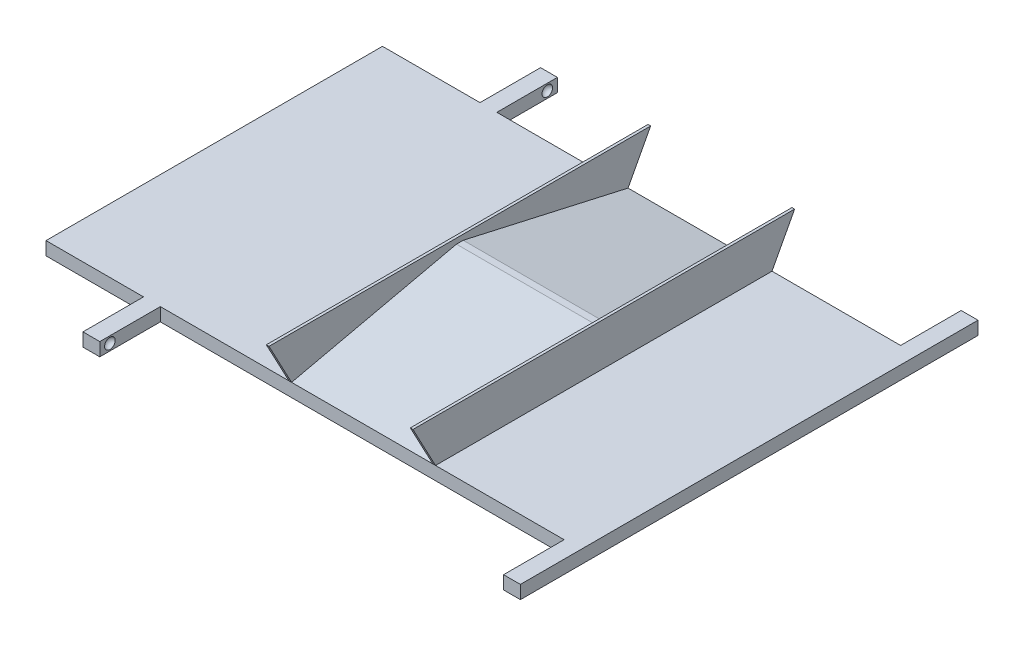
ISO-10303-21;
HEADER;
FILE_DESCRIPTION(('STEP AP214'),'2;1');
FILE_NAME('part.step','',(''),(''),'','','');
FILE_SCHEMA(('AUTOMOTIVE_DESIGN { 1 0 10303 214 1 1 1 1 }'));
ENDSEC;
DATA;
#1=APPLICATION_CONTEXT('core data for automotive mechanical design processes');
#2=APPLICATION_PROTOCOL_DEFINITION('international standard','automotive_design',2000,#1);
#3=PRODUCT_CONTEXT('',#1,'mechanical');
#4=PRODUCT('Part','Part','',(#3));
#5=PRODUCT_RELATED_PRODUCT_CATEGORY('part','',(#4));
#6=PRODUCT_DEFINITION_FORMATION('','',#4);
#7=PRODUCT_DEFINITION_CONTEXT('part definition',#1,'design');
#8=PRODUCT_DEFINITION('design','',#6,#7);
#9=PRODUCT_DEFINITION_SHAPE('','',#8);
#10=(LENGTH_UNIT() NAMED_UNIT(*) SI_UNIT(.MILLI.,.METRE.));
#11=(NAMED_UNIT(*) PLANE_ANGLE_UNIT() SI_UNIT($,.RADIAN.));
#12=(NAMED_UNIT(*) SI_UNIT($,.STERADIAN.) SOLID_ANGLE_UNIT());
#13=UNCERTAINTY_MEASURE_WITH_UNIT(LENGTH_MEASURE(1.E-05),#10,'distance_accuracy_value','');
#14=(GEOMETRIC_REPRESENTATION_CONTEXT(3) GLOBAL_UNCERTAINTY_ASSIGNED_CONTEXT((#13)) GLOBAL_UNIT_ASSIGNED_CONTEXT((#10,
#11,#12)) REPRESENTATION_CONTEXT('',''));
#15=CARTESIAN_POINT('',(0.,0.,0.));
#16=DIRECTION('',(0.,0.,1.));
#17=DIRECTION('',(1.,0.,0.));
#18=AXIS2_PLACEMENT_3D('',#15,#16,#17);
#19=CARTESIAN_POINT('',(0.,5.,0.));
#20=DIRECTION('',(0.,1.,0.));
#21=DIRECTION('',(0.,0.,1.));
#22=AXIS2_PLACEMENT_3D('',#19,#20,#21);
#23=PLANE('',#22);
#24=DIRECTION('',(1.,0.,0.));
#25=VECTOR('',#24,1.);
#26=CARTESIAN_POINT('',(-76.2,5.,63.5000000000001));
#27=LINE('',#26,#25);
#28=CARTESIAN_POINT('',(-76.2,5.,63.5000000000001));
#29=VERTEX_POINT('',#28);
#30=CARTESIAN_POINT('',(-27.67,5.,63.5000000000001));
#31=VERTEX_POINT('',#30);
#32=EDGE_CURVE('E371',#29,#31,#27,.T.);
#33=ORIENTED_EDGE('',*,*,#32,.T.);
#34=DIRECTION('',(0.,0.,1.));
#35=VECTOR('',#34,1.);
#36=CARTESIAN_POINT('',(-27.67,5.,-63.5));
#37=LINE('',#36,#35);
#38=CARTESIAN_POINT('',(-27.67,5.,-63.5));
#39=VERTEX_POINT('',#38);
#40=EDGE_CURVE('E66',#39,#31,#37,.T.);
#41=ORIENTED_EDGE('',*,*,#40,.F.);
#42=DIRECTION('',(-1.,0.,0.));
#43=VECTOR('',#42,1.);
#44=CARTESIAN_POINT('',(-76.2,5.,-63.5));
#45=LINE('',#44,#43);
#46=CARTESIAN_POINT('',(-76.2,5.,-63.5));
#47=VERTEX_POINT('',#46);
#48=EDGE_CURVE('E347',#39,#47,#45,.T.);
#49=ORIENTED_EDGE('',*,*,#48,.T.);
#50=DIRECTION('',(0.,0.,-1.));
#51=VECTOR('',#50,1.);
#52=CARTESIAN_POINT('',(-76.2,5.,-86.36));
#53=LINE('',#52,#51);
#54=CARTESIAN_POINT('',(-76.2,5.,-86.36));
#55=VERTEX_POINT('',#54);
#56=EDGE_CURVE('E357',#47,#55,#53,.T.);
#57=ORIENTED_EDGE('',*,*,#56,.T.);
#58=DIRECTION('',(-1.,0.,0.));
#59=VECTOR('',#58,1.);
#60=CARTESIAN_POINT('',(-82.55,5.,-86.3600000000001));
#61=LINE('',#60,#59);
#62=CARTESIAN_POINT('',(-82.55,5.,-86.3600000000001));
#63=VERTEX_POINT('',#62);
#64=EDGE_CURVE('E675',#55,#63,#61,.T.);
#65=ORIENTED_EDGE('',*,*,#64,.T.);
#66=DIRECTION('',(0.,0.,1.));
#67=VECTOR('',#66,1.);
#68=CARTESIAN_POINT('',(-82.55,5.,-63.5000000000001));
#69=LINE('',#68,#67);
#70=CARTESIAN_POINT('',(-82.55,5.,-63.5000000000001));
#71=VERTEX_POINT('',#70);
#72=EDGE_CURVE('E490',#63,#71,#69,.T.);
#73=ORIENTED_EDGE('',*,*,#72,.T.);
#74=DIRECTION('',(-1.,0.,0.));
#75=VECTOR('',#74,1.);
#76=CARTESIAN_POINT('',(-119.360030459113,5.,-63.5));
#77=LINE('',#76,#75);
#78=CARTESIAN_POINT('',(-119.360030459113,5.,-63.5));
#79=VERTEX_POINT('',#78);
#80=EDGE_CURVE('E485',#71,#79,#77,.T.);
#81=ORIENTED_EDGE('',*,*,#80,.T.);
#82=DIRECTION('',(0.,0.,1.));
#83=VECTOR('',#82,1.);
#84=CARTESIAN_POINT('',(-119.360030459113,5.,-63.5));
#85=LINE('',#84,#83);
#86=CARTESIAN_POINT('',(-119.360030459113,5.,63.5));
#87=VERTEX_POINT('',#86);
#88=EDGE_CURVE('E649',#79,#87,#85,.T.);
#89=ORIENTED_EDGE('',*,*,#88,.T.);
#90=DIRECTION('',(1.,0.,0.));
#91=VECTOR('',#90,1.);
#92=CARTESIAN_POINT('',(-119.360030459113,5.,63.5));
#93=LINE('',#92,#91);
#94=CARTESIAN_POINT('',(-82.55,5.,63.5000000000001));
#95=VERTEX_POINT('',#94);
#96=EDGE_CURVE('E608',#87,#95,#93,.T.);
#97=ORIENTED_EDGE('',*,*,#96,.T.);
#98=DIRECTION('',(0.,0.,1.));
#99=VECTOR('',#98,1.);
#100=CARTESIAN_POINT('',(-82.55,5.,63.5000000000001));
#101=LINE('',#100,#99);
#102=CARTESIAN_POINT('',(-82.55,5.,86.3600000000001));
#103=VERTEX_POINT('',#102);
#104=EDGE_CURVE('E647',#95,#103,#101,.T.);
#105=ORIENTED_EDGE('',*,*,#104,.T.);
#106=DIRECTION('',(1.,0.,0.));
#107=VECTOR('',#106,1.);
#108=CARTESIAN_POINT('',(-82.55,5.,86.3600000000001));
#109=LINE('',#108,#107);
#110=CARTESIAN_POINT('',(-76.2,5.,86.36));
#111=VERTEX_POINT('',#110);
#112=EDGE_CURVE('E644',#103,#111,#109,.T.);
#113=ORIENTED_EDGE('',*,*,#112,.T.);
#114=DIRECTION('',(0.,0.,-1.));
#115=VECTOR('',#114,1.);
#116=CARTESIAN_POINT('',(-76.2,5.,86.36));
#117=LINE('',#116,#115);
#118=EDGE_CURVE('E377',#111,#29,#117,.T.);
#119=ORIENTED_EDGE('',*,*,#118,.T.);
#120=EDGE_LOOP('',(#33,#41,#49,#57,#65,#73,#81,#89,#97,#105,#113,#119));
#121=FACE_BOUND('',#120,.T.);
#122=ADVANCED_FACE('F41',(#121),#23,.T.);
#123=CARTESIAN_POINT('',(76.2,5.,-63.5));
#124=VERTEX_POINT('',#123);
#125=CARTESIAN_POINT('',(27.67,5.,-63.5));
#126=VERTEX_POINT('',#125);
#127=EDGE_CURVE('E364',#124,#126,#45,.T.);
#128=ORIENTED_EDGE('',*,*,#127,.T.);
#129=DIRECTION('',(0.,0.,-1.));
#130=VECTOR('',#129,1.);
#131=CARTESIAN_POINT('',(27.67,5.,63.5));
#132=LINE('',#131,#130);
#133=CARTESIAN_POINT('',(27.67,5.,63.5));
#134=VERTEX_POINT('',#133);
#135=EDGE_CURVE('E248',#134,#126,#132,.T.);
#136=ORIENTED_EDGE('',*,*,#135,.F.);
#137=CARTESIAN_POINT('',(76.2,5.,63.5));
#138=VERTEX_POINT('',#137);
#139=EDGE_CURVE('E372',#134,#138,#27,.T.);
#140=ORIENTED_EDGE('',*,*,#139,.T.);
#141=DIRECTION('',(0.,0.,1.));
#142=VECTOR('',#141,1.);
#143=CARTESIAN_POINT('',(76.2,5.,63.5));
#144=LINE('',#143,#142);
#145=CARTESIAN_POINT('',(76.2,5.,86.36));
#146=VERTEX_POINT('',#145);
#147=EDGE_CURVE('E379',#138,#146,#144,.T.);
#148=ORIENTED_EDGE('',*,*,#147,.T.);
#149=DIRECTION('',(1.,0.,0.));
#150=VECTOR('',#149,1.);
#151=CARTESIAN_POINT('',(76.2,5.,86.36));
#152=LINE('',#151,#150);
#153=CARTESIAN_POINT('',(82.55,5.,86.36));
#154=VERTEX_POINT('',#153);
#155=EDGE_CURVE('E636',#146,#154,#152,.T.);
#156=ORIENTED_EDGE('',*,*,#155,.T.);
#157=DIRECTION('',(0.,0.,-1.));
#158=VECTOR('',#157,1.);
#159=CARTESIAN_POINT('',(82.55,5.,-86.3600000000001));
#160=LINE('',#159,#158);
#161=CARTESIAN_POINT('',(82.55,5.,-86.3600000000001));
#162=VERTEX_POINT('',#161);
#163=EDGE_CURVE('E634',#154,#162,#160,.T.);
#164=ORIENTED_EDGE('',*,*,#163,.T.);
#165=DIRECTION('',(-1.,0.,0.));
#166=VECTOR('',#165,1.);
#167=CARTESIAN_POINT('',(76.2,5.,-86.36));
#168=LINE('',#167,#166);
#169=CARTESIAN_POINT('',(76.2,5.,-86.36));
#170=VERTEX_POINT('',#169);
#171=EDGE_CURVE('E925',#162,#170,#168,.T.);
#172=ORIENTED_EDGE('',*,*,#171,.T.);
#173=DIRECTION('',(0.,0.,1.));
#174=VECTOR('',#173,1.);
#175=CARTESIAN_POINT('',(76.2,5.,-63.5));
#176=LINE('',#175,#174);
#177=EDGE_CURVE('E351',#170,#124,#176,.T.);
#178=ORIENTED_EDGE('',*,*,#177,.T.);
#179=EDGE_LOOP('',(#128,#136,#140,#148,#156,#164,#172,#178));
#180=FACE_BOUND('',#179,.T.);
#181=ADVANCED_FACE('F424',(#180),#23,.T.);
#182=CARTESIAN_POINT('',(-119.360030459113,5.,-63.5));
#183=DIRECTION('',(0.,0.,1.));
#184=DIRECTION('',(1.,0.,0.));
#185=AXIS2_PLACEMENT_3D('',#182,#183,#184);
#186=PLANE('',#185);
#187=DIRECTION('',(-1.,0.,0.));
#188=VECTOR('',#187,1.);
#189=CARTESIAN_POINT('',(-119.360030459113,0.,-63.5));
#190=LINE('',#189,#188);
#191=CARTESIAN_POINT('',(-82.55,0.,-63.5000000000001));
#192=VERTEX_POINT('',#191);
#193=CARTESIAN_POINT('',(-119.360030459113,0.,-63.5));
#194=VERTEX_POINT('',#193);
#195=EDGE_CURVE('E524',#192,#194,#190,.T.);
#196=ORIENTED_EDGE('',*,*,#195,.T.);
#197=DIRECTION('',(0.,-1.,0.));
#198=VECTOR('',#197,1.);
#199=CARTESIAN_POINT('',(-119.360030459113,5.,-63.5));
#200=LINE('',#199,#198);
#201=EDGE_CURVE('E12',#79,#194,#200,.T.);
#202=ORIENTED_EDGE('',*,*,#201,.F.);
#203=ORIENTED_EDGE('',*,*,#80,.F.);
#204=DIRECTION('',(0.,-1.,0.));
#205=VECTOR('',#204,1.);
#206=CARTESIAN_POINT('',(-82.55,5.,-63.5000000000001));
#207=LINE('',#206,#205);
#208=EDGE_CURVE('E486',#71,#192,#207,.T.);
#209=ORIENTED_EDGE('',*,*,#208,.T.);
#210=EDGE_LOOP('',(#196,#202,#203,#209));
#211=FACE_BOUND('',#210,.T.);
#212=ADVANCED_FACE('F43',(#211),#186,.F.);
#213=CARTESIAN_POINT('',(-119.360030459113,5.,-63.5));
#214=DIRECTION('',(1.,0.,0.));
#215=DIRECTION('',(0.,0.,-1.));
#216=AXIS2_PLACEMENT_3D('',#213,#214,#215);
#217=PLANE('',#216);
#218=DIRECTION('',(0.,0.,1.));
#219=VECTOR('',#218,1.);
#220=CARTESIAN_POINT('',(-119.360030459113,0.,-63.5));
#221=LINE('',#220,#219);
#222=CARTESIAN_POINT('',(-119.360030459113,0.,63.5));
#223=VERTEX_POINT('',#222);
#224=EDGE_CURVE('E600',#194,#223,#221,.T.);
#225=ORIENTED_EDGE('',*,*,#224,.T.);
#226=DIRECTION('',(0.,-1.,0.));
#227=VECTOR('',#226,1.);
#228=CARTESIAN_POINT('',(-119.360030459113,5.,63.5));
#229=LINE('',#228,#227);
#230=EDGE_CURVE('E51',#87,#223,#229,.T.);
#231=ORIENTED_EDGE('',*,*,#230,.F.);
#232=ORIENTED_EDGE('',*,*,#88,.F.);
#233=ORIENTED_EDGE('',*,*,#201,.T.);
#234=EDGE_LOOP('',(#225,#231,#232,#233));
#235=FACE_BOUND('',#234,.T.);
#236=ADVANCED_FACE('F591',(#235),#217,.F.);
#237=CARTESIAN_POINT('',(-119.360030459113,5.,63.5));
#238=DIRECTION('',(0.,0.,-1.));
#239=DIRECTION('',(-1.,0.,0.));
#240=AXIS2_PLACEMENT_3D('',#237,#238,#239);
#241=PLANE('',#240);
#242=DIRECTION('',(1.,0.,0.));
#243=VECTOR('',#242,1.);
#244=CARTESIAN_POINT('',(-119.360030459113,0.,63.5));
#245=LINE('',#244,#243);
#246=CARTESIAN_POINT('',(-82.55,0.,63.5000000000001));
#247=VERTEX_POINT('',#246);
#248=EDGE_CURVE('E605',#223,#247,#245,.T.);
#249=ORIENTED_EDGE('',*,*,#248,.T.);
#250=DIRECTION('',(0.,-1.,0.));
#251=VECTOR('',#250,1.);
#252=CARTESIAN_POINT('',(-82.55,5.,63.5000000000001));
#253=LINE('',#252,#251);
#254=EDGE_CURVE('E517',#95,#247,#253,.T.);
#255=ORIENTED_EDGE('',*,*,#254,.F.);
#256=ORIENTED_EDGE('',*,*,#96,.F.);
#257=ORIENTED_EDGE('',*,*,#230,.T.);
#258=EDGE_LOOP('',(#249,#255,#256,#257));
#259=FACE_BOUND('',#258,.T.);
#260=ADVANCED_FACE('F588',(#259),#241,.F.);
#261=CARTESIAN_POINT('',(-82.55,5.,63.5000000000001));
#262=DIRECTION('',(1.,0.,0.));
#263=DIRECTION('',(0.,0.,-1.));
#264=AXIS2_PLACEMENT_3D('',#261,#262,#263);
#265=PLANE('',#264);
#266=DIRECTION('',(0.,0.,1.));
#267=VECTOR('',#266,1.);
#268=CARTESIAN_POINT('',(-82.55,0.,63.5000000000001));
#269=LINE('',#268,#267);
#270=CARTESIAN_POINT('',(-82.55,0.,86.3600000000001));
#271=VERTEX_POINT('',#270);
#272=EDGE_CURVE('E611',#247,#271,#269,.T.);
#273=ORIENTED_EDGE('',*,*,#272,.T.);
#274=DIRECTION('',(0.,-1.,0.));
#275=VECTOR('',#274,1.);
#276=CARTESIAN_POINT('',(-82.55,5.,86.3600000000001));
#277=LINE('',#276,#275);
#278=EDGE_CURVE('E514',#103,#271,#277,.T.);
#279=ORIENTED_EDGE('',*,*,#278,.F.);
#280=ORIENTED_EDGE('',*,*,#104,.F.);
#281=ORIENTED_EDGE('',*,*,#254,.T.);
#282=EDGE_LOOP('',(#273,#279,#280,#281));
#283=FACE_BOUND('',#282,.T.);
#284=ADVANCED_FACE('F584',(#283),#265,.F.);
#285=CARTESIAN_POINT('',(-82.55,5.,86.3600000000001));
#286=DIRECTION('',(0.,0.,-1.));
#287=DIRECTION('',(-1.,0.,0.));
#288=AXIS2_PLACEMENT_3D('',#285,#286,#287);
#289=PLANE('',#288);
#290=DIRECTION('',(1.,0.,0.));
#291=VECTOR('',#290,1.);
#292=CARTESIAN_POINT('',(-82.55,0.,86.3600000000001));
#293=LINE('',#292,#291);
#294=CARTESIAN_POINT('',(-76.2,0.,86.36));
#295=VERTEX_POINT('',#294);
#296=EDGE_CURVE('E613',#271,#295,#293,.T.);
#297=ORIENTED_EDGE('',*,*,#296,.T.);
#298=DIRECTION('',(0.,-1.,0.));
#299=VECTOR('',#298,1.);
#300=CARTESIAN_POINT('',(-76.2,5.,86.36));
#301=LINE('',#300,#299);
#302=EDGE_CURVE('E511',#111,#295,#301,.T.);
#303=ORIENTED_EDGE('',*,*,#302,.F.);
#304=ORIENTED_EDGE('',*,*,#112,.F.);
#305=ORIENTED_EDGE('',*,*,#278,.T.);
#306=EDGE_LOOP('',(#297,#303,#304,#305));
#307=FACE_BOUND('',#306,.T.);
#308=ADVANCED_FACE('F580',(#307),#289,.F.);
#309=CARTESIAN_POINT('',(-76.2,5.,86.36));
#310=DIRECTION('',(-1.,0.,0.));
#311=DIRECTION('',(0.,0.,1.));
#312=AXIS2_PLACEMENT_3D('',#309,#310,#311);
#313=PLANE('',#312);
#314=CARTESIAN_POINT('',(-76.2,2.5,82.55));
#315=DIRECTION('',(-1.,0.,0.));
#316=DIRECTION('',(0.,0.,1.));
#317=AXIS2_PLACEMENT_3D('',#314,#315,#316);
#318=CIRCLE('',#317,2.);
#319=CARTESIAN_POINT('',(-76.2,2.5,84.55));
#320=VERTEX_POINT('',#319);
#321=EDGE_CURVE('E522',#320,#320,#318,.F.);
#322=ORIENTED_EDGE('',*,*,#321,.F.);
#323=EDGE_LOOP('',(#322));
#324=FACE_BOUND('',#323,.T.);
#325=DIRECTION('',(0.,0.,-1.));
#326=VECTOR('',#325,1.);
#327=CARTESIAN_POINT('',(-76.2,0.,86.36));
#328=LINE('',#327,#326);
#329=CARTESIAN_POINT('',(-76.2,0.,63.5000000000001));
#330=VERTEX_POINT('',#329);
#331=EDGE_CURVE('E618',#295,#330,#328,.T.);
#332=ORIENTED_EDGE('',*,*,#331,.T.);
#333=DIRECTION('',(0.,-1.,0.));
#334=VECTOR('',#333,1.);
#335=CARTESIAN_POINT('',(-76.2,5.,63.5000000000001));
#336=LINE('',#335,#334);
#337=EDGE_CURVE('E508',#29,#330,#336,.T.);
#338=ORIENTED_EDGE('',*,*,#337,.F.);
#339=ORIENTED_EDGE('',*,*,#118,.F.);
#340=ORIENTED_EDGE('',*,*,#302,.T.);
#341=EDGE_LOOP('',(#332,#338,#339,#340));
#342=FACE_BOUND('',#341,.T.);
#343=ADVANCED_FACE('F577',(#324,#342),#313,.F.);
#344=CARTESIAN_POINT('',(-76.2,5.,63.5000000000001));
#345=DIRECTION('',(0.,0.,-1.));
#346=DIRECTION('',(-1.,0.,0.));
#347=AXIS2_PLACEMENT_3D('',#344,#345,#346);
#348=PLANE('',#347);
#349=DIRECTION('',(1.,0.,0.));
#350=VECTOR('',#349,1.);
#351=CARTESIAN_POINT('',(-76.2,0.,63.5000000000001));
#352=LINE('',#351,#350);
#353=CARTESIAN_POINT('',(76.2,0.,63.5));
#354=VERTEX_POINT('',#353);
#355=EDGE_CURVE('E620',#330,#354,#352,.T.);
#356=ORIENTED_EDGE('',*,*,#355,.T.);
#357=DIRECTION('',(0.,-1.,0.));
#358=VECTOR('',#357,1.);
#359=CARTESIAN_POINT('',(76.2,5.,63.5));
#360=LINE('',#359,#358);
#361=EDGE_CURVE('E421',#138,#354,#360,.T.);
#362=ORIENTED_EDGE('',*,*,#361,.F.);
#363=ORIENTED_EDGE('',*,*,#139,.F.);
#364=CARTESIAN_POINT('',(26.67,5.,63.5));
#365=VERTEX_POINT('',#364);
#366=EDGE_CURVE('E367',#365,#134,#27,.T.);
#367=ORIENTED_EDGE('',*,*,#366,.F.);
#368=DIRECTION('',(1.,0.,0.));
#369=VECTOR('',#368,1.);
#370=CARTESIAN_POINT('',(-26.67,5.,63.5000000000001));
#371=LINE('',#370,#369);
#372=CARTESIAN_POINT('',(-26.67,5.,63.5000000000001));
#373=VERTEX_POINT('',#372);
#374=EDGE_CURVE('E282',#373,#365,#371,.T.);
#375=ORIENTED_EDGE('',*,*,#374,.F.);
#376=DIRECTION('',(1.,0.,0.));
#377=VECTOR('',#376,1.);
#378=CARTESIAN_POINT('',(-27.67,5.,63.5000000000001));
#379=LINE('',#378,#377);
#380=EDGE_CURVE('E59',#31,#373,#379,.T.);
#381=ORIENTED_EDGE('',*,*,#380,.F.);
#382=ORIENTED_EDGE('',*,*,#32,.F.);
#383=ORIENTED_EDGE('',*,*,#337,.T.);
#384=EDGE_LOOP('',(#356,#362,#363,#367,#375,#381,#382,#383));
#385=FACE_BOUND('',#384,.T.);
#386=ADVANCED_FACE('F418',(#385),#348,.F.);
#387=CARTESIAN_POINT('',(76.2,5.,63.5));
#388=DIRECTION('',(1.,0.,0.));
#389=DIRECTION('',(0.,0.,-1.));
#390=AXIS2_PLACEMENT_3D('',#387,#388,#389);
#391=PLANE('',#390);
#392=CARTESIAN_POINT('',(76.2,2.5,82.55));
#393=DIRECTION('',(1.,0.,0.));
#394=DIRECTION('',(0.,0.,-1.));
#395=AXIS2_PLACEMENT_3D('',#392,#393,#394);
#396=CIRCLE('',#395,2.);
#397=CARTESIAN_POINT('',(76.2,2.5,80.55));
#398=VERTEX_POINT('',#397);
#399=EDGE_CURVE('E330',#398,#398,#396,.T.);
#400=ORIENTED_EDGE('',*,*,#399,.T.);
#401=EDGE_LOOP('',(#400));
#402=FACE_BOUND('',#401,.T.);
#403=DIRECTION('',(0.,0.,1.));
#404=VECTOR('',#403,1.);
#405=CARTESIAN_POINT('',(76.2,0.,63.5));
#406=LINE('',#405,#404);
#407=CARTESIAN_POINT('',(76.2,0.,86.36));
#408=VERTEX_POINT('',#407);
#409=EDGE_CURVE('E622',#354,#408,#406,.T.);
#410=ORIENTED_EDGE('',*,*,#409,.T.);
#411=DIRECTION('',(0.,-1.,0.));
#412=VECTOR('',#411,1.);
#413=CARTESIAN_POINT('',(76.2,5.,86.36));
#414=LINE('',#413,#412);
#415=EDGE_CURVE('E504',#146,#408,#414,.T.);
#416=ORIENTED_EDGE('',*,*,#415,.F.);
#417=ORIENTED_EDGE('',*,*,#147,.F.);
#418=ORIENTED_EDGE('',*,*,#361,.T.);
#419=EDGE_LOOP('',(#410,#416,#417,#418));
#420=FACE_BOUND('',#419,.T.);
#421=ADVANCED_FACE('F528',(#402,#420),#391,.F.);
#422=CARTESIAN_POINT('',(76.2,5.,86.36));
#423=DIRECTION('',(0.,0.,-1.));
#424=DIRECTION('',(-1.,0.,0.));
#425=AXIS2_PLACEMENT_3D('',#422,#423,#424);
#426=PLANE('',#425);
#427=DIRECTION('',(1.,0.,0.));
#428=VECTOR('',#427,1.);
#429=CARTESIAN_POINT('',(76.2,0.,86.36));
#430=LINE('',#429,#428);
#431=CARTESIAN_POINT('',(82.55,0.,86.36));
#432=VERTEX_POINT('',#431);
#433=EDGE_CURVE('E624',#408,#432,#430,.T.);
#434=ORIENTED_EDGE('',*,*,#433,.T.);
#435=DIRECTION('',(0.,-1.,0.));
#436=VECTOR('',#435,1.);
#437=CARTESIAN_POINT('',(82.55,5.,86.36));
#438=LINE('',#437,#436);
#439=EDGE_CURVE('E501',#154,#432,#438,.T.);
#440=ORIENTED_EDGE('',*,*,#439,.F.);
#441=ORIENTED_EDGE('',*,*,#155,.F.);
#442=ORIENTED_EDGE('',*,*,#415,.T.);
#443=EDGE_LOOP('',(#434,#440,#441,#442));
#444=FACE_BOUND('',#443,.T.);
#445=ADVANCED_FACE('F568',(#444),#426,.F.);
#446=CARTESIAN_POINT('',(82.55,5.,-86.3600000000001));
#447=DIRECTION('',(-1.,0.,0.));
#448=DIRECTION('',(0.,0.,1.));
#449=AXIS2_PLACEMENT_3D('',#446,#447,#448);
#450=PLANE('',#449);
#451=DIRECTION('',(0.,0.,-1.));
#452=VECTOR('',#451,1.);
#453=CARTESIAN_POINT('',(82.55,0.,-86.3600000000001));
#454=LINE('',#453,#452);
#455=CARTESIAN_POINT('',(82.55,0.,-86.3600000000001));
#456=VERTEX_POINT('',#455);
#457=EDGE_CURVE('E626',#432,#456,#454,.T.);
#458=ORIENTED_EDGE('',*,*,#457,.T.);
#459=DIRECTION('',(0.,-1.,0.));
#460=VECTOR('',#459,1.);
#461=CARTESIAN_POINT('',(82.55,5.,-86.3600000000001));
#462=LINE('',#461,#460);
#463=EDGE_CURVE('E498',#162,#456,#462,.T.);
#464=ORIENTED_EDGE('',*,*,#463,.F.);
#465=ORIENTED_EDGE('',*,*,#163,.F.);
#466=ORIENTED_EDGE('',*,*,#439,.T.);
#467=EDGE_LOOP('',(#458,#464,#465,#466));
#468=FACE_BOUND('',#467,.T.);
#469=ADVANCED_FACE('F564',(#468),#450,.F.);
#470=CARTESIAN_POINT('',(76.2,5.,-86.36));
#471=DIRECTION('',(0.,0.,1.));
#472=DIRECTION('',(1.,0.,0.));
#473=AXIS2_PLACEMENT_3D('',#470,#471,#472);
#474=PLANE('',#473);
#475=DIRECTION('',(-1.,0.,0.));
#476=VECTOR('',#475,1.);
#477=CARTESIAN_POINT('',(76.2,0.,-86.36));
#478=LINE('',#477,#476);
#479=CARTESIAN_POINT('',(76.2,0.,-86.36));
#480=VERTEX_POINT('',#479);
#481=EDGE_CURVE('E466',#456,#480,#478,.T.);
#482=ORIENTED_EDGE('',*,*,#481,.T.);
#483=DIRECTION('',(0.,-1.,0.));
#484=VECTOR('',#483,1.);
#485=CARTESIAN_POINT('',(76.2,5.,-86.36));
#486=LINE('',#485,#484);
#487=EDGE_CURVE('E461',#170,#480,#486,.T.);
#488=ORIENTED_EDGE('',*,*,#487,.F.);
#489=ORIENTED_EDGE('',*,*,#171,.F.);
#490=ORIENTED_EDGE('',*,*,#463,.T.);
#491=EDGE_LOOP('',(#482,#488,#489,#490));
#492=FACE_BOUND('',#491,.T.);
#493=ADVANCED_FACE('F452',(#492),#474,.F.);
#494=CARTESIAN_POINT('',(76.2,5.,-63.5));
#495=DIRECTION('',(1.,0.,0.));
#496=DIRECTION('',(0.,0.,-1.));
#497=AXIS2_PLACEMENT_3D('',#494,#495,#496);
#498=PLANE('',#497);
#499=CARTESIAN_POINT('',(76.2,2.5,-82.55));
#500=DIRECTION('',(1.,0.,0.));
#501=DIRECTION('',(0.,0.,-1.));
#502=AXIS2_PLACEMENT_3D('',#499,#500,#501);
#503=CIRCLE('',#502,1.90500000000001);
#504=CARTESIAN_POINT('',(76.2,2.5,-84.455));
#505=VERTEX_POINT('',#504);
#506=EDGE_CURVE('E386',#505,#505,#503,.F.);
#507=ORIENTED_EDGE('',*,*,#506,.F.);
#508=EDGE_LOOP('',(#507));
#509=FACE_BOUND('',#508,.T.);
#510=DIRECTION('',(0.,0.,1.));
#511=VECTOR('',#510,1.);
#512=CARTESIAN_POINT('',(76.2,0.,-63.5));
#513=LINE('',#512,#511);
#514=CARTESIAN_POINT('',(76.2,0.,-63.5));
#515=VERTEX_POINT('',#514);
#516=EDGE_CURVE('E457',#480,#515,#513,.T.);
#517=ORIENTED_EDGE('',*,*,#516,.T.);
#518=DIRECTION('',(0.,-1.,0.));
#519=VECTOR('',#518,1.);
#520=CARTESIAN_POINT('',(76.2,5.,-63.5));
#521=LINE('',#520,#519);
#522=EDGE_CURVE('E459',#124,#515,#521,.T.);
#523=ORIENTED_EDGE('',*,*,#522,.F.);
#524=ORIENTED_EDGE('',*,*,#177,.F.);
#525=ORIENTED_EDGE('',*,*,#487,.T.);
#526=EDGE_LOOP('',(#517,#523,#524,#525));
#527=FACE_BOUND('',#526,.T.);
#528=ADVANCED_FACE('F449',(#509,#527),#498,.F.);
#529=CARTESIAN_POINT('',(-76.2,5.,-63.5));
#530=DIRECTION('',(0.,0.,1.));
#531=DIRECTION('',(1.,0.,0.));
#532=AXIS2_PLACEMENT_3D('',#529,#530,#531);
#533=PLANE('',#532);
#534=DIRECTION('',(-1.,0.,0.));
#535=VECTOR('',#534,1.);
#536=CARTESIAN_POINT('',(-76.2,0.,-63.5));
#537=LINE('',#536,#535);
#538=CARTESIAN_POINT('',(-76.2,0.,-63.5));
#539=VERTEX_POINT('',#538);
#540=EDGE_CURVE('E465',#515,#539,#537,.T.);
#541=ORIENTED_EDGE('',*,*,#540,.T.);
#542=DIRECTION('',(0.,-1.,0.));
#543=VECTOR('',#542,1.);
#544=CARTESIAN_POINT('',(-76.2,5.,-63.5));
#545=LINE('',#544,#543);
#546=EDGE_CURVE('E470',#47,#539,#545,.T.);
#547=ORIENTED_EDGE('',*,*,#546,.F.);
#548=ORIENTED_EDGE('',*,*,#48,.F.);
#549=CARTESIAN_POINT('',(-26.67,5.,-63.5));
#550=VERTEX_POINT('',#549);
#551=EDGE_CURVE('E350',#550,#39,#45,.T.);
#552=ORIENTED_EDGE('',*,*,#551,.F.);
#553=DIRECTION('',(-1.,0.,0.));
#554=VECTOR('',#553,1.);
#555=CARTESIAN_POINT('',(-26.67,5.,-63.5));
#556=LINE('',#555,#554);
#557=CARTESIAN_POINT('',(26.67,5.,-63.5));
#558=VERTEX_POINT('',#557);
#559=EDGE_CURVE('E415',#558,#550,#556,.T.);
#560=ORIENTED_EDGE('',*,*,#559,.F.);
#561=DIRECTION('',(-1.,0.,0.));
#562=VECTOR('',#561,1.);
#563=CARTESIAN_POINT('',(27.67,5.,-63.5));
#564=LINE('',#563,#562);
#565=EDGE_CURVE('E263',#126,#558,#564,.T.);
#566=ORIENTED_EDGE('',*,*,#565,.F.);
#567=ORIENTED_EDGE('',*,*,#127,.F.);
#568=ORIENTED_EDGE('',*,*,#522,.T.);
#569=EDGE_LOOP('',(#541,#547,#548,#552,#560,#566,#567,#568));
#570=FACE_BOUND('',#569,.T.);
#571=ADVANCED_FACE('F431',(#570),#533,.F.);
#572=CARTESIAN_POINT('',(-76.2,5.,-86.36));
#573=DIRECTION('',(-1.,0.,0.));
#574=DIRECTION('',(0.,0.,1.));
#575=AXIS2_PLACEMENT_3D('',#572,#573,#574);
#576=PLANE('',#575);
#577=CARTESIAN_POINT('',(-76.2,2.5,-82.55));
#578=DIRECTION('',(-1.,0.,0.));
#579=DIRECTION('',(0.,0.,1.));
#580=AXIS2_PLACEMENT_3D('',#577,#578,#579);
#581=CIRCLE('',#580,2.);
#582=CARTESIAN_POINT('',(-76.2,2.5,-80.55));
#583=VERTEX_POINT('',#582);
#584=EDGE_CURVE('E436',#583,#583,#581,.F.);
#585=ORIENTED_EDGE('',*,*,#584,.F.);
#586=EDGE_LOOP('',(#585));
#587=FACE_BOUND('',#586,.T.);
#588=DIRECTION('',(0.,0.,-1.));
#589=VECTOR('',#588,1.);
#590=CARTESIAN_POINT('',(-76.2,0.,-86.36));
#591=LINE('',#590,#589);
#592=CARTESIAN_POINT('',(-76.2,0.,-86.36));
#593=VERTEX_POINT('',#592);
#594=EDGE_CURVE('E476',#539,#593,#591,.T.);
#595=ORIENTED_EDGE('',*,*,#594,.T.);
#596=DIRECTION('',(0.,-1.,0.));
#597=VECTOR('',#596,1.);
#598=CARTESIAN_POINT('',(-76.2,5.,-86.36));
#599=LINE('',#598,#597);
#600=EDGE_CURVE('E493',#55,#593,#599,.T.);
#601=ORIENTED_EDGE('',*,*,#600,.F.);
#602=ORIENTED_EDGE('',*,*,#56,.F.);
#603=ORIENTED_EDGE('',*,*,#546,.T.);
#604=EDGE_LOOP('',(#595,#601,#602,#603));
#605=FACE_BOUND('',#604,.T.);
#606=ADVANCED_FACE('F555',(#587,#605),#576,.F.);
#607=CARTESIAN_POINT('',(-82.55,5.,-86.3600000000001));
#608=DIRECTION('',(0.,0.,1.));
#609=DIRECTION('',(1.,0.,0.));
#610=AXIS2_PLACEMENT_3D('',#607,#608,#609);
#611=PLANE('',#610);
#612=DIRECTION('',(-1.,0.,0.));
#613=VECTOR('',#612,1.);
#614=CARTESIAN_POINT('',(-82.55,0.,-86.3600000000001));
#615=LINE('',#614,#613);
#616=CARTESIAN_POINT('',(-82.55,0.,-86.3600000000001));
#617=VERTEX_POINT('',#616);
#618=EDGE_CURVE('E478',#593,#617,#615,.T.);
#619=ORIENTED_EDGE('',*,*,#618,.T.);
#620=DIRECTION('',(0.,-1.,0.));
#621=VECTOR('',#620,1.);
#622=CARTESIAN_POINT('',(-82.55,5.,-86.3600000000001));
#623=LINE('',#622,#621);
#624=EDGE_CURVE('E489',#63,#617,#623,.T.);
#625=ORIENTED_EDGE('',*,*,#624,.F.);
#626=ORIENTED_EDGE('',*,*,#64,.F.);
#627=ORIENTED_EDGE('',*,*,#600,.T.);
#628=EDGE_LOOP('',(#619,#625,#626,#627));
#629=FACE_BOUND('',#628,.T.);
#630=ADVANCED_FACE('F551',(#629),#611,.F.);
#631=CARTESIAN_POINT('',(-82.55,5.,-63.5000000000001));
#632=DIRECTION('',(1.,0.,0.));
#633=DIRECTION('',(0.,0.,-1.));
#634=AXIS2_PLACEMENT_3D('',#631,#632,#633);
#635=PLANE('',#634);
#636=DIRECTION('',(0.,0.,1.));
#637=VECTOR('',#636,1.);
#638=CARTESIAN_POINT('',(-82.55,0.,-63.5000000000001));
#639=LINE('',#638,#637);
#640=EDGE_CURVE('E483',#617,#192,#639,.T.);
#641=ORIENTED_EDGE('',*,*,#640,.T.);
#642=ORIENTED_EDGE('',*,*,#208,.F.);
#643=ORIENTED_EDGE('',*,*,#72,.F.);
#644=ORIENTED_EDGE('',*,*,#624,.T.);
#645=EDGE_LOOP('',(#641,#642,#643,#644));
#646=FACE_BOUND('',#645,.T.);
#647=ADVANCED_FACE('F548',(#646),#635,.F.);
#648=CARTESIAN_POINT('',(0.,0.,0.));
#649=DIRECTION('',(0.,1.,0.));
#650=DIRECTION('',(0.,0.,1.));
#651=AXIS2_PLACEMENT_3D('',#648,#649,#650);
#652=PLANE('',#651);
#653=ORIENTED_EDGE('',*,*,#195,.F.);
#654=ORIENTED_EDGE('',*,*,#640,.F.);
#655=ORIENTED_EDGE('',*,*,#618,.F.);
#656=ORIENTED_EDGE('',*,*,#594,.F.);
#657=ORIENTED_EDGE('',*,*,#540,.F.);
#658=ORIENTED_EDGE('',*,*,#516,.F.);
#659=ORIENTED_EDGE('',*,*,#481,.F.);
#660=ORIENTED_EDGE('',*,*,#457,.F.);
#661=ORIENTED_EDGE('',*,*,#433,.F.);
#662=ORIENTED_EDGE('',*,*,#409,.F.);
#663=ORIENTED_EDGE('',*,*,#355,.F.);
#664=ORIENTED_EDGE('',*,*,#331,.F.);
#665=ORIENTED_EDGE('',*,*,#296,.F.);
#666=ORIENTED_EDGE('',*,*,#272,.F.);
#667=ORIENTED_EDGE('',*,*,#248,.F.);
#668=ORIENTED_EDGE('',*,*,#224,.F.);
#669=EDGE_LOOP('',(#653,#654,#655,#656,#657,#658,#659,#660,#661,#662,#663,#664,#665,#666,#667,#668));
#670=FACE_BOUND('',#669,.T.);
#671=ADVANCED_FACE('F474',(#670),#652,.F.);
#672=CARTESIAN_POINT('',(-76.2,2.5,82.55));
#673=DIRECTION('',(0.,1.,0.));
#674=DIRECTION('',(0.,0.,-1.));
#675=AXIS2_PLACEMENT_3D('',#672,#673,#674);
#676=SPHERICAL_SURFACE('',#675,2.);
#677=CARTESIAN_POINT('',(-76.2,2.5,82.55));
#678=DIRECTION('',(-1.,0.,0.));
#679=DIRECTION('',(0.,0.,1.));
#680=AXIS2_PLACEMENT_3D('',#677,#678,#679);
#681=SPHERICAL_SURFACE('',#680,2.);
#682=ORIENTED_EDGE('',*,*,#321,.T.);
#683=EDGE_LOOP('',(#682));
#684=FACE_BOUND('',#683,.T.);
#685=ADVANCED_FACE('F533',(#684),#681,.F.);
#686=CARTESIAN_POINT('',(76.2,2.5,82.55));
#687=DIRECTION('',(0.,-1.,0.));
#688=DIRECTION('',(0.,0.,-1.));
#689=AXIS2_PLACEMENT_3D('',#686,#687,#688);
#690=SPHERICAL_SURFACE('',#689,2.);
#691=CARTESIAN_POINT('',(76.2,2.5,82.55));
#692=DIRECTION('',(1.,0.,0.));
#693=DIRECTION('',(0.,0.,-1.));
#694=AXIS2_PLACEMENT_3D('',#691,#692,#693);
#695=SPHERICAL_SURFACE('',#694,2.);
#696=ORIENTED_EDGE('',*,*,#399,.F.);
#697=EDGE_LOOP('',(#696));
#698=FACE_BOUND('',#697,.T.);
#699=ADVANCED_FACE('F531',(#698),#695,.F.);
#700=CARTESIAN_POINT('',(0.,19.05,0.));
#701=DIRECTION('',(0.,-1.,0.));
#702=DIRECTION('',(0.,0.,-1.));
#703=AXIS2_PLACEMENT_3D('',#700,#701,#702);
#704=PLANE('',#703);
#705=DIRECTION('',(0.,0.,-1.));
#706=VECTOR('',#705,1.);
#707=CARTESIAN_POINT('',(26.67,19.05,-1.27));
#708=LINE('',#707,#706);
#709=CARTESIAN_POINT('',(26.67,19.05,1.27));
#710=VERTEX_POINT('',#709);
#711=CARTESIAN_POINT('',(26.67,19.05,-1.27));
#712=VERTEX_POINT('',#711);
#713=EDGE_CURVE('E273',#710,#712,#708,.T.);
#714=ORIENTED_EDGE('',*,*,#713,.T.);
#715=DIRECTION('',(-1.,0.,0.));
#716=VECTOR('',#715,1.);
#717=CARTESIAN_POINT('',(26.67,19.05,-1.27));
#718=LINE('',#717,#716);
#719=CARTESIAN_POINT('',(-26.67,19.05,-1.26999999999999));
#720=VERTEX_POINT('',#719);
#721=EDGE_CURVE('E289',#712,#720,#718,.T.);
#722=ORIENTED_EDGE('',*,*,#721,.T.);
#723=DIRECTION('',(0.,0.,1.));
#724=VECTOR('',#723,1.);
#725=CARTESIAN_POINT('',(-26.67,19.05,-1.26999999999999));
#726=LINE('',#725,#724);
#727=CARTESIAN_POINT('',(-26.67,19.05,1.26999999999999));
#728=VERTEX_POINT('',#727);
#729=EDGE_CURVE('E331',#720,#728,#726,.T.);
#730=ORIENTED_EDGE('',*,*,#729,.T.);
#731=DIRECTION('',(1.,0.,0.));
#732=VECTOR('',#731,1.);
#733=CARTESIAN_POINT('',(26.67,19.05,1.27));
#734=LINE('',#733,#732);
#735=EDGE_CURVE('E45',#728,#710,#734,.T.);
#736=ORIENTED_EDGE('',*,*,#735,.T.);
#737=EDGE_LOOP('',(#714,#722,#730,#736));
#738=FACE_BOUND('',#737,.T.);
#739=ADVANCED_FACE('F307',(#738),#704,.F.);
#740=CARTESIAN_POINT('',(0.,18.398861759705,-4.15400944438141));
#741=DIRECTION('',(0.,-0.975447519905753,0.220232004735269));
#742=DIRECTION('',(0.,-0.220232004735269,-0.975447519905753));
#743=AXIS2_PLACEMENT_3D('',#740,#741,#742);
#744=PLANE('',#743);
#745=DIRECTION('',(0.,0.220232004735269,0.975447519905753));
#746=VECTOR('',#745,1.);
#747=CARTESIAN_POINT('',(-26.67,5.,-63.5));
#748=LINE('',#747,#746);
#749=EDGE_CURVE('E277',#550,#720,#748,.T.);
#750=ORIENTED_EDGE('',*,*,#749,.T.);
#751=ORIENTED_EDGE('',*,*,#721,.F.);
#752=DIRECTION('',(0.,0.22023200473527,0.975447519905753));
#753=VECTOR('',#752,1.);
#754=CARTESIAN_POINT('',(26.67,5.,-63.5));
#755=LINE('',#754,#753);
#756=EDGE_CURVE('E268',#558,#712,#755,.T.);
#757=ORIENTED_EDGE('',*,*,#756,.F.);
#758=ORIENTED_EDGE('',*,*,#559,.T.);
#759=EDGE_LOOP('',(#750,#751,#757,#758));
#760=FACE_BOUND('',#759,.T.);
#761=ADVANCED_FACE('F296',(#760),#744,.F.);
#762=CARTESIAN_POINT('',(0.,18.398861759705,4.1540094443814));
#763=DIRECTION('',(0.,-0.975447519905753,-0.220232004735269));
#764=DIRECTION('',(0.,0.220232004735269,-0.975447519905753));
#765=AXIS2_PLACEMENT_3D('',#762,#763,#764);
#766=PLANE('',#765);
#767=DIRECTION('',(0.,0.220232004735269,-0.975447519905753));
#768=VECTOR('',#767,1.);
#769=CARTESIAN_POINT('',(26.67,5.,63.5000000000001));
#770=LINE('',#769,#768);
#771=EDGE_CURVE('E267',#365,#710,#770,.T.);
#772=ORIENTED_EDGE('',*,*,#771,.T.);
#773=ORIENTED_EDGE('',*,*,#735,.F.);
#774=DIRECTION('',(0.,0.220232004735269,-0.975447519905753));
#775=VECTOR('',#774,1.);
#776=CARTESIAN_POINT('',(-26.67,5.,63.5000000000001));
#777=LINE('',#776,#775);
#778=EDGE_CURVE('E264',#373,#728,#777,.T.);
#779=ORIENTED_EDGE('',*,*,#778,.F.);
#780=ORIENTED_EDGE('',*,*,#374,.T.);
#781=EDGE_LOOP('',(#772,#773,#779,#780));
#782=FACE_BOUND('',#781,.T.);
#783=ADVANCED_FACE('F306',(#782),#766,.F.);
#784=CARTESIAN_POINT('',(-76.2,2.5,-82.55));
#785=DIRECTION('',(0.,1.,0.));
#786=DIRECTION('',(0.,0.,-1.));
#787=AXIS2_PLACEMENT_3D('',#784,#785,#786);
#788=SPHERICAL_SURFACE('',#787,2.);
#789=CARTESIAN_POINT('',(-76.2,2.5,-82.55));
#790=DIRECTION('',(-1.,0.,0.));
#791=DIRECTION('',(0.,0.,1.));
#792=AXIS2_PLACEMENT_3D('',#789,#790,#791);
#793=SPHERICAL_SURFACE('',#792,2.);
#794=ORIENTED_EDGE('',*,*,#584,.T.);
#795=EDGE_LOOP('',(#794));
#796=FACE_BOUND('',#795,.T.);
#797=ADVANCED_FACE('F308',(#796),#793,.F.);
#798=CARTESIAN_POINT('',(76.2,2.5,-82.55));
#799=DIRECTION('',(0.,1.,0.));
#800=DIRECTION('',(0.,0.,1.));
#801=AXIS2_PLACEMENT_3D('',#798,#799,#800);
#802=SPHERICAL_SURFACE('',#801,1.90500000000001);
#803=CARTESIAN_POINT('',(76.2,2.5,-82.55));
#804=DIRECTION('',(1.,0.,0.));
#805=DIRECTION('',(0.,0.,-1.));
#806=AXIS2_PLACEMENT_3D('',#803,#804,#805);
#807=SPHERICAL_SURFACE('',#806,1.90500000000001);
#808=ORIENTED_EDGE('',*,*,#506,.T.);
#809=EDGE_LOOP('',(#808));
#810=FACE_BOUND('',#809,.T.);
#811=ADVANCED_FACE('F447',(#810),#807,.F.);
#812=CARTESIAN_POINT('',(26.67,0.,0.));
#813=DIRECTION('',(-1.,0.,0.));
#814=DIRECTION('',(0.,-1.,0.));
#815=AXIS2_PLACEMENT_3D('',#812,#813,#814);
#816=PLANE('',#815);
#817=ORIENTED_EDGE('',*,*,#756,.T.);
#818=ORIENTED_EDGE('',*,*,#713,.F.);
#819=ORIENTED_EDGE('',*,*,#771,.F.);
#820=DIRECTION('',(0.,-0.882947592858924,-0.469471562785896));
#821=VECTOR('',#820,1.);
#822=CARTESIAN_POINT('',(26.67,5.,63.5));
#823=LINE('',#822,#821);
#824=CARTESIAN_POINT('',(26.67,21.05,72.0339363781669));
#825=VERTEX_POINT('',#824);
#826=EDGE_CURVE('E388',#825,#365,#823,.T.);
#827=ORIENTED_EDGE('',*,*,#826,.F.);
#828=DIRECTION('',(0.,0.,1.));
#829=VECTOR('',#828,1.);
#830=CARTESIAN_POINT('',(26.67,21.05,72.0339363781669));
#831=LINE('',#830,#829);
#832=CARTESIAN_POINT('',(26.67,21.05,-72.0339363781667));
#833=VERTEX_POINT('',#832);
#834=EDGE_CURVE('E249',#833,#825,#831,.T.);
#835=ORIENTED_EDGE('',*,*,#834,.F.);
#836=DIRECTION('',(0.,0.882947592858928,-0.469471562785889));
#837=VECTOR('',#836,1.);
#838=CARTESIAN_POINT('',(26.67,5.,-63.5));
#839=LINE('',#838,#837);
#840=EDGE_CURVE('E257',#558,#833,#839,.T.);
#841=ORIENTED_EDGE('',*,*,#840,.F.);
#842=EDGE_LOOP('',(#817,#818,#819,#827,#835,#841));
#843=FACE_BOUND('',#842,.T.);
#844=ADVANCED_FACE('F408',(#843),#816,.T.);
#845=CARTESIAN_POINT('',(27.67,5.,63.5));
#846=DIRECTION('',(0.,0.469471562785896,-0.882947592858924));
#847=DIRECTION('',(0.,0.882947592858924,0.469471562785896));
#848=AXIS2_PLACEMENT_3D('',#845,#846,#847);
#849=PLANE('',#848);
#850=ORIENTED_EDGE('',*,*,#826,.T.);
#851=ORIENTED_EDGE('',*,*,#366,.T.);
#852=DIRECTION('',(0.,-0.882947592858924,-0.469471562785896));
#853=VECTOR('',#852,1.);
#854=CARTESIAN_POINT('',(27.67,5.,63.5));
#855=LINE('',#854,#853);
#856=CARTESIAN_POINT('',(27.67,21.05,72.0339363781669));
#857=VERTEX_POINT('',#856);
#858=EDGE_CURVE('E246',#857,#134,#855,.T.);
#859=ORIENTED_EDGE('',*,*,#858,.F.);
#860=DIRECTION('',(-1.,0.,0.));
#861=VECTOR('',#860,1.);
#862=CARTESIAN_POINT('',(27.67,21.05,72.0339363781669));
#863=LINE('',#862,#861);
#864=EDGE_CURVE('E255',#857,#825,#863,.T.);
#865=ORIENTED_EDGE('',*,*,#864,.T.);
#866=EDGE_LOOP('',(#850,#851,#859,#865));
#867=FACE_BOUND('',#866,.T.);
#868=ADVANCED_FACE('F411',(#867),#849,.F.);
#869=CARTESIAN_POINT('',(27.67,5.,-63.5));
#870=DIRECTION('',(0.,0.469471562785889,0.882947592858928));
#871=DIRECTION('',(0.,-0.882947592858928,0.469471562785889));
#872=AXIS2_PLACEMENT_3D('',#869,#870,#871);
#873=PLANE('',#872);
#874=ORIENTED_EDGE('',*,*,#840,.T.);
#875=DIRECTION('',(-1.,0.,0.));
#876=VECTOR('',#875,1.);
#877=CARTESIAN_POINT('',(27.67,21.05,-72.0339363781667));
#878=LINE('',#877,#876);
#879=CARTESIAN_POINT('',(27.67,21.05,-72.0339363781667));
#880=VERTEX_POINT('',#879);
#881=EDGE_CURVE('E260',#880,#833,#878,.T.);
#882=ORIENTED_EDGE('',*,*,#881,.F.);
#883=DIRECTION('',(0.,0.882947592858928,-0.469471562785889));
#884=VECTOR('',#883,1.);
#885=CARTESIAN_POINT('',(27.67,5.,-63.5));
#886=LINE('',#885,#884);
#887=EDGE_CURVE('E251',#126,#880,#886,.T.);
#888=ORIENTED_EDGE('',*,*,#887,.F.);
#889=ORIENTED_EDGE('',*,*,#565,.T.);
#890=EDGE_LOOP('',(#874,#882,#888,#889));
#891=FACE_BOUND('',#890,.T.);
#892=ADVANCED_FACE('F398',(#891),#873,.F.);
#893=CARTESIAN_POINT('',(27.67,21.05,72.0339363781669));
#894=DIRECTION('',(0.,-1.,0.));
#895=DIRECTION('',(1.,0.,0.));
#896=AXIS2_PLACEMENT_3D('',#893,#894,#895);
#897=PLANE('',#896);
#898=ORIENTED_EDGE('',*,*,#834,.T.);
#899=ORIENTED_EDGE('',*,*,#864,.F.);
#900=DIRECTION('',(0.,0.,1.));
#901=VECTOR('',#900,1.);
#902=CARTESIAN_POINT('',(27.67,21.05,72.0339363781669));
#903=LINE('',#902,#901);
#904=EDGE_CURVE('E253',#880,#857,#903,.T.);
#905=ORIENTED_EDGE('',*,*,#904,.F.);
#906=ORIENTED_EDGE('',*,*,#881,.T.);
#907=EDGE_LOOP('',(#898,#899,#905,#906));
#908=FACE_BOUND('',#907,.T.);
#909=ADVANCED_FACE('F405',(#908),#897,.F.);
#910=CARTESIAN_POINT('',(27.67,0.,0.));
#911=DIRECTION('',(-1.,0.,0.));
#912=DIRECTION('',(0.,-1.,0.));
#913=AXIS2_PLACEMENT_3D('',#910,#911,#912);
#914=PLANE('',#913);
#915=ORIENTED_EDGE('',*,*,#858,.T.);
#916=ORIENTED_EDGE('',*,*,#135,.T.);
#917=ORIENTED_EDGE('',*,*,#887,.T.);
#918=ORIENTED_EDGE('',*,*,#904,.T.);
#919=EDGE_LOOP('',(#915,#916,#917,#918));
#920=FACE_BOUND('',#919,.T.);
#921=ADVANCED_FACE('F428',(#920),#914,.F.);
#922=CARTESIAN_POINT('',(-26.67,0.,0.));
#923=DIRECTION('',(1.,0.,0.));
#924=DIRECTION('',(0.,1.,0.));
#925=AXIS2_PLACEMENT_3D('',#922,#923,#924);
#926=PLANE('',#925);
#927=ORIENTED_EDGE('',*,*,#749,.F.);
#928=DIRECTION('',(0.,-0.882947592858927,0.46947156278589));
#929=VECTOR('',#928,1.);
#930=CARTESIAN_POINT('',(-26.67,5.,-63.5));
#931=LINE('',#930,#929);
#932=CARTESIAN_POINT('',(-26.67,21.0499999999999,-72.0339363781667));
#933=VERTEX_POINT('',#932);
#934=EDGE_CURVE('E686',#933,#550,#931,.T.);
#935=ORIENTED_EDGE('',*,*,#934,.F.);
#936=DIRECTION('',(0.,0.,-1.));
#937=VECTOR('',#936,1.);
#938=CARTESIAN_POINT('',(-26.67,21.0499999999999,-72.0339363781667));
#939=LINE('',#938,#937);
#940=CARTESIAN_POINT('',(-26.67,21.0499999999999,72.0339363781669));
#941=VERTEX_POINT('',#940);
#942=EDGE_CURVE('E243',#941,#933,#939,.T.);
#943=ORIENTED_EDGE('',*,*,#942,.F.);
#944=DIRECTION('',(0.,0.882947592858925,0.469471562785895));
#945=VECTOR('',#944,1.);
#946=CARTESIAN_POINT('',(-26.67,5.,63.5000000000001));
#947=LINE('',#946,#945);
#948=EDGE_CURVE('E231',#373,#941,#947,.T.);
#949=ORIENTED_EDGE('',*,*,#948,.F.);
#950=ORIENTED_EDGE('',*,*,#778,.T.);
#951=ORIENTED_EDGE('',*,*,#729,.F.);
#952=EDGE_LOOP('',(#927,#935,#943,#949,#950,#951));
#953=FACE_BOUND('',#952,.T.);
#954=ADVANCED_FACE('F692',(#953),#926,.T.);
#955=CARTESIAN_POINT('',(-27.67,5.,-63.5));
#956=DIRECTION('',(0.,0.46947156278589,0.882947592858927));
#957=DIRECTION('',(0.,-0.882947592858927,0.46947156278589));
#958=AXIS2_PLACEMENT_3D('',#955,#956,#957);
#959=PLANE('',#958);
#960=ORIENTED_EDGE('',*,*,#934,.T.);
#961=ORIENTED_EDGE('',*,*,#551,.T.);
#962=DIRECTION('',(0.,-0.882947592858927,0.46947156278589));
#963=VECTOR('',#962,1.);
#964=CARTESIAN_POINT('',(-27.67,5.,-63.5));
#965=LINE('',#964,#963);
#966=CARTESIAN_POINT('',(-27.67,21.0499999999999,-72.0339363781667));
#967=VERTEX_POINT('',#966);
#968=EDGE_CURVE('E244',#967,#39,#965,.T.);
#969=ORIENTED_EDGE('',*,*,#968,.F.);
#970=DIRECTION('',(1.,0.,0.));
#971=VECTOR('',#970,1.);
#972=CARTESIAN_POINT('',(-27.67,21.0499999999999,-72.0339363781667));
#973=LINE('',#972,#971);
#974=EDGE_CURVE('E234',#967,#933,#973,.T.);
#975=ORIENTED_EDGE('',*,*,#974,.T.);
#976=EDGE_LOOP('',(#960,#961,#969,#975));
#977=FACE_BOUND('',#976,.T.);
#978=ADVANCED_FACE('F684',(#977),#959,.F.);
#979=CARTESIAN_POINT('',(-27.67,5.,63.5000000000001));
#980=DIRECTION('',(0.,0.469471562785895,-0.882947592858925));
#981=DIRECTION('',(0.,0.882947592858925,0.469471562785895));
#982=AXIS2_PLACEMENT_3D('',#979,#980,#981);
#983=PLANE('',#982);
#984=ORIENTED_EDGE('',*,*,#948,.T.);
#985=DIRECTION('',(1.,0.,0.));
#986=VECTOR('',#985,1.);
#987=CARTESIAN_POINT('',(-27.67,21.0499999999999,72.0339363781669));
#988=LINE('',#987,#986);
#989=CARTESIAN_POINT('',(-27.67,21.0499999999999,72.0339363781669));
#990=VERTEX_POINT('',#989);
#991=EDGE_CURVE('E228',#990,#941,#988,.T.);
#992=ORIENTED_EDGE('',*,*,#991,.F.);
#993=DIRECTION('',(0.,0.882947592858925,0.469471562785895));
#994=VECTOR('',#993,1.);
#995=CARTESIAN_POINT('',(-27.67,5.,63.5000000000001));
#996=LINE('',#995,#994);
#997=EDGE_CURVE('E218',#31,#990,#996,.T.);
#998=ORIENTED_EDGE('',*,*,#997,.F.);
#999=ORIENTED_EDGE('',*,*,#380,.T.);
#1000=EDGE_LOOP('',(#984,#992,#998,#999));
#1001=FACE_BOUND('',#1000,.T.);
#1002=ADVANCED_FACE('F229',(#1001),#983,.F.);
#1003=CARTESIAN_POINT('',(-27.67,21.0499999999999,-72.0339363781667));
#1004=DIRECTION('',(0.,-1.,0.));
#1005=DIRECTION('',(1.,0.,0.));
#1006=AXIS2_PLACEMENT_3D('',#1003,#1004,#1005);
#1007=PLANE('',#1006);
#1008=ORIENTED_EDGE('',*,*,#942,.T.);
#1009=ORIENTED_EDGE('',*,*,#974,.F.);
#1010=DIRECTION('',(0.,0.,-1.));
#1011=VECTOR('',#1010,1.);
#1012=CARTESIAN_POINT('',(-27.67,21.0499999999999,-72.0339363781667));
#1013=LINE('',#1012,#1011);
#1014=EDGE_CURVE('E223',#990,#967,#1013,.T.);
#1015=ORIENTED_EDGE('',*,*,#1014,.F.);
#1016=ORIENTED_EDGE('',*,*,#991,.T.);
#1017=EDGE_LOOP('',(#1008,#1009,#1015,#1016));
#1018=FACE_BOUND('',#1017,.T.);
#1019=ADVANCED_FACE('F236',(#1018),#1007,.F.);
#1020=CARTESIAN_POINT('',(-27.67,0.,0.));
#1021=DIRECTION('',(1.,0.,0.));
#1022=DIRECTION('',(0.,1.,0.));
#1023=AXIS2_PLACEMENT_3D('',#1020,#1021,#1022);
#1024=PLANE('',#1023);
#1025=ORIENTED_EDGE('',*,*,#968,.T.);
#1026=ORIENTED_EDGE('',*,*,#40,.T.);
#1027=ORIENTED_EDGE('',*,*,#997,.T.);
#1028=ORIENTED_EDGE('',*,*,#1014,.T.);
#1029=EDGE_LOOP('',(#1025,#1026,#1027,#1028));
#1030=FACE_BOUND('',#1029,.T.);
#1031=ADVANCED_FACE('F221',(#1030),#1024,.F.);
#1032=CLOSED_SHELL('',(#122,#181,#212,#236,#260,#284,#308,#343,#386,#421,#445,#469,#493,#528,
#571,#606,#630,#647,#671,#685,#699,#739,#761,#783,#797,#811,#844,#868,#892,#909,#921,#954,#978,
#1002,#1019,#1031));
#1033=MANIFOLD_SOLID_BREP('B2',#1032);
#1034=ADVANCED_BREP_SHAPE_REPRESENTATION('',(#18,#1033),#14);
#1035=SHAPE_DEFINITION_REPRESENTATION(#9,#1034);
ENDSEC;
END-ISO-10303-21;
